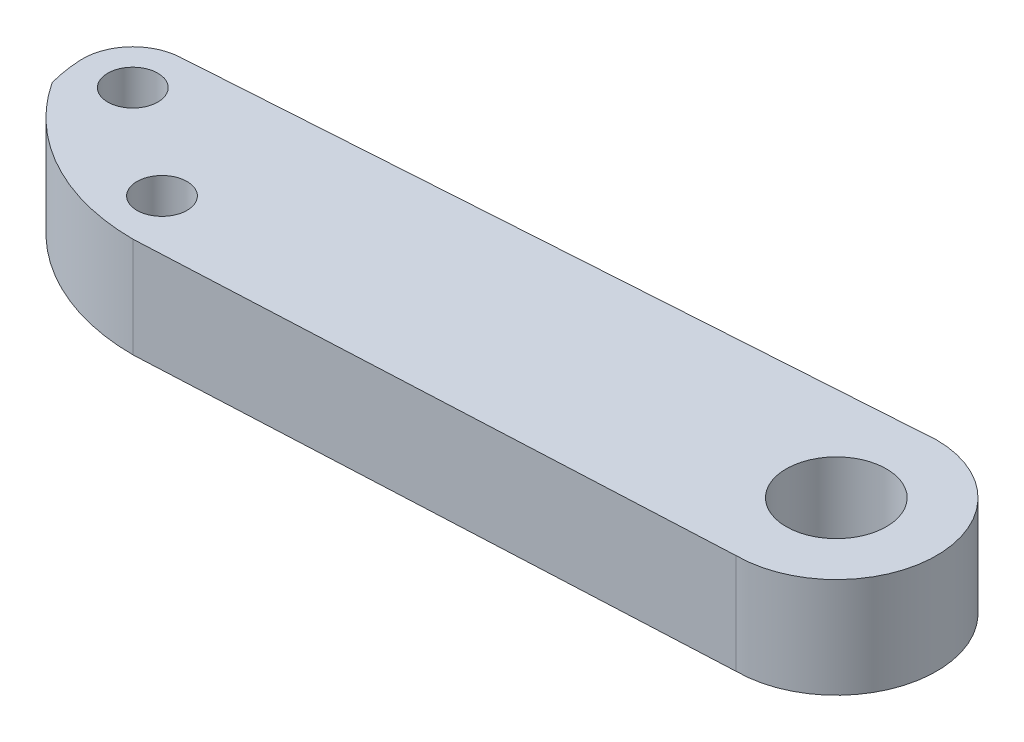
ISO-10303-21;
HEADER;
FILE_DESCRIPTION(('STEP AP214'),'2;1');
FILE_NAME('part.step','',(''),(''),'','','');
FILE_SCHEMA(('AUTOMOTIVE_DESIGN { 1 0 10303 214 1 1 1 1 }'));
ENDSEC;
DATA;
#1=APPLICATION_CONTEXT('core data for automotive mechanical design processes');
#2=APPLICATION_PROTOCOL_DEFINITION('international standard','automotive_design',2000,#1);
#3=PRODUCT_CONTEXT('',#1,'mechanical');
#4=PRODUCT('Part','Part','',(#3));
#5=PRODUCT_RELATED_PRODUCT_CATEGORY('part','',(#4));
#6=PRODUCT_DEFINITION_FORMATION('','',#4);
#7=PRODUCT_DEFINITION_CONTEXT('part definition',#1,'design');
#8=PRODUCT_DEFINITION('design','',#6,#7);
#9=PRODUCT_DEFINITION_SHAPE('','',#8);
#10=(LENGTH_UNIT() NAMED_UNIT(*) SI_UNIT(.MILLI.,.METRE.));
#11=(NAMED_UNIT(*) PLANE_ANGLE_UNIT() SI_UNIT($,.RADIAN.));
#12=(NAMED_UNIT(*) SI_UNIT($,.STERADIAN.) SOLID_ANGLE_UNIT());
#13=UNCERTAINTY_MEASURE_WITH_UNIT(LENGTH_MEASURE(1.E-05),#10,'distance_accuracy_value','');
#14=(GEOMETRIC_REPRESENTATION_CONTEXT(3) GLOBAL_UNCERTAINTY_ASSIGNED_CONTEXT((#13)) GLOBAL_UNIT_ASSIGNED_CONTEXT((#10,
#11,#12)) REPRESENTATION_CONTEXT('',''));
#15=CARTESIAN_POINT('',(0.,0.,0.));
#16=DIRECTION('',(0.,0.,1.));
#17=DIRECTION('',(1.,0.,0.));
#18=AXIS2_PLACEMENT_3D('',#15,#16,#17);
#19=CARTESIAN_POINT('',(0.247096779714024,4.,5.16918233201002));
#20=DIRECTION('',(-0.0477473874810918,0.,-0.998859443059298));
#21=DIRECTION('',(-0.998859443059298,0.,0.0477473874810918));
#22=AXIS2_PLACEMENT_3D('',#19,#20,#21);
#23=PLANE('',#22);
#24=DIRECTION('',(0.998859443059298,0.,-0.0477473874810918));
#25=VECTOR('',#24,1.);
#26=CARTESIAN_POINT('',(0.247096779714024,0.,5.16918233201002));
#27=LINE('',#26,#25);
#28=CARTESIAN_POINT('',(-4.48088767881538,0.,5.39518901144288));
#29=VERTEX_POINT('',#28);
#30=CARTESIAN_POINT('',(18.4839806159632,0.,4.29742448356832));
#31=VERTEX_POINT('',#30);
#32=EDGE_CURVE('E128',#29,#31,#27,.T.);
#33=ORIENTED_EDGE('',*,*,#32,.T.);
#34=DIRECTION('',(0.,-1.,0.));
#35=VECTOR('',#34,1.);
#36=CARTESIAN_POINT('',(18.4839806159632,4.,4.29742448356832));
#37=LINE('',#36,#35);
#38=CARTESIAN_POINT('',(18.4839806159632,4.,4.29742448356832));
#39=VERTEX_POINT('',#38);
#40=EDGE_CURVE('E11',#39,#31,#37,.T.);
#41=ORIENTED_EDGE('',*,*,#40,.F.);
#42=DIRECTION('',(0.998859443059298,0.,-0.0477473874810918));
#43=VECTOR('',#42,1.);
#44=CARTESIAN_POINT('',(0.247096779714024,4.,5.16918233201002));
#45=LINE('',#44,#43);
#46=CARTESIAN_POINT('',(-4.48088767881538,4.,5.39518901144288));
#47=VERTEX_POINT('',#46);
#48=EDGE_CURVE('E153',#47,#39,#45,.T.);
#49=ORIENTED_EDGE('',*,*,#48,.F.);
#50=DIRECTION('',(0.,-1.,0.));
#51=VECTOR('',#50,1.);
#52=CARTESIAN_POINT('',(-4.48088767881538,4.,5.39518901144288));
#53=LINE('',#52,#51);
#54=EDGE_CURVE('E118',#47,#29,#53,.T.);
#55=ORIENTED_EDGE('',*,*,#54,.T.);
#56=EDGE_LOOP('',(#33,#41,#49,#55));
#57=FACE_BOUND('',#56,.T.);
#58=ADVANCED_FACE('F34',(#57),#23,.F.);
#59=CARTESIAN_POINT('',(18.4839806159632,4.,0.297424483568243));
#60=DIRECTION('',(0.,-1.,0.));
#61=DIRECTION('',(0.,0.,-1.));
#62=AXIS2_PLACEMENT_3D('',#59,#60,#61);
#63=CYLINDRICAL_SURFACE('',#62,4.00000000000008);
#64=CARTESIAN_POINT('',(18.4839806159632,0.,0.297424483568243));
#65=DIRECTION('',(0.,1.,0.));
#66=DIRECTION('',(0.,0.,1.));
#67=AXIS2_PLACEMENT_3D('',#64,#65,#66);
#68=CIRCLE('',#67,4.00000000000008);
#69=CARTESIAN_POINT('',(18.4839806159632,0.,-3.70257551643184));
#70=VERTEX_POINT('',#69);
#71=EDGE_CURVE('E131',#31,#70,#68,.T.);
#72=ORIENTED_EDGE('',*,*,#71,.T.);
#73=DIRECTION('',(0.,-1.,0.));
#74=VECTOR('',#73,1.);
#75=CARTESIAN_POINT('',(18.4839806159632,4.,-3.70257551643184));
#76=LINE('',#75,#74);
#77=CARTESIAN_POINT('',(18.4839806159632,4.,-3.70257551643184));
#78=VERTEX_POINT('',#77);
#79=EDGE_CURVE('E43',#78,#70,#76,.T.);
#80=ORIENTED_EDGE('',*,*,#79,.F.);
#81=CARTESIAN_POINT('',(18.4839806159632,4.,0.297424483568243));
#82=DIRECTION('',(0.,1.,0.));
#83=DIRECTION('',(0.,0.,1.));
#84=AXIS2_PLACEMENT_3D('',#81,#82,#83);
#85=CIRCLE('',#84,4.00000000000008);
#86=EDGE_CURVE('E87',#39,#78,#85,.T.);
#87=ORIENTED_EDGE('',*,*,#86,.F.);
#88=ORIENTED_EDGE('',*,*,#40,.T.);
#89=EDGE_LOOP('',(#72,#80,#87,#88));
#90=FACE_BOUND('',#89,.T.);
#91=ADVANCED_FACE('F146',(#90),#63,.T.);
#92=CARTESIAN_POINT('',(-0.163034536543457,4.,-2.4735086919785));
#93=DIRECTION('',(-0.0657695447513612,0.,-0.997834839531673));
#94=DIRECTION('',(-0.997834839531673,0.,0.0657695447513612));
#95=AXIS2_PLACEMENT_3D('',#92,#93,#94);
#96=PLANE('',#95);
#97=DIRECTION('',(0.997834839531673,0.,-0.0657695447513612));
#98=VECTOR('',#97,1.);
#99=CARTESIAN_POINT('',(-0.163034536543457,0.,-2.4735086919785));
#100=LINE('',#99,#98);
#101=CARTESIAN_POINT('',(-9.863309787302,0.,-1.83414167257806));
#102=VERTEX_POINT('',#101);
#103=EDGE_CURVE('E134',#102,#70,#100,.T.);
#104=ORIENTED_EDGE('',*,*,#103,.F.);
#105=DIRECTION('',(0.,-1.,0.));
#106=VECTOR('',#105,1.);
#107=CARTESIAN_POINT('',(-9.863309787302,4.,-1.83414167257806));
#108=LINE('',#107,#106);
#109=CARTESIAN_POINT('',(-9.863309787302,4.,-1.83414167257806));
#110=VERTEX_POINT('',#109);
#111=EDGE_CURVE('E103',#110,#102,#108,.T.);
#112=ORIENTED_EDGE('',*,*,#111,.F.);
#113=DIRECTION('',(0.997834839531673,0.,-0.0657695447513612));
#114=VECTOR('',#113,1.);
#115=CARTESIAN_POINT('',(-0.163034536543457,4.,-2.4735086919785));
#116=LINE('',#115,#114);
#117=EDGE_CURVE('E112',#110,#78,#116,.T.);
#118=ORIENTED_EDGE('',*,*,#117,.T.);
#119=ORIENTED_EDGE('',*,*,#79,.T.);
#120=EDGE_LOOP('',(#104,#112,#118,#119));
#121=FACE_BOUND('',#120,.T.);
#122=ADVANCED_FACE('F145',(#121),#96,.T.);
#123=CARTESIAN_POINT('',(-9.73177069779925,4.,0.161528006485447));
#124=DIRECTION('',(0.,-1.,0.));
#125=DIRECTION('',(0.,0.,-1.));
#126=AXIS2_PLACEMENT_3D('',#123,#124,#125);
#127=CYLINDRICAL_SURFACE('',#126,2.00000000000009);
#128=CARTESIAN_POINT('',(-9.73177069779925,0.,0.161528006485447));
#129=DIRECTION('',(0.,1.,0.));
#130=DIRECTION('',(0.,0.,1.));
#131=AXIS2_PLACEMENT_3D('',#128,#129,#130);
#132=CIRCLE('',#131,2.00000000000009);
#133=CARTESIAN_POINT('',(-11.729046010991,0.,0.265889509516957));
#134=VERTEX_POINT('',#133);
#135=EDGE_CURVE('E102',#134,#102,#132,.F.);
#136=ORIENTED_EDGE('',*,*,#135,.F.);
#137=DIRECTION('',(0.,-1.,0.));
#138=VECTOR('',#137,1.);
#139=CARTESIAN_POINT('',(-11.729046010991,4.,0.265889509516957));
#140=LINE('',#139,#138);
#141=CARTESIAN_POINT('',(-11.729046010991,4.,0.265889509516957));
#142=VERTEX_POINT('',#141);
#143=EDGE_CURVE('E96',#142,#134,#140,.T.);
#144=ORIENTED_EDGE('',*,*,#143,.F.);
#145=CARTESIAN_POINT('',(-9.73177069779925,4.,0.161528006485447));
#146=DIRECTION('',(0.,1.,0.));
#147=DIRECTION('',(0.,0.,1.));
#148=AXIS2_PLACEMENT_3D('',#145,#146,#147);
#149=CIRCLE('',#148,2.00000000000009);
#150=EDGE_CURVE('E100',#142,#110,#149,.F.);
#151=ORIENTED_EDGE('',*,*,#150,.T.);
#152=ORIENTED_EDGE('',*,*,#111,.T.);
#153=EDGE_LOOP('',(#136,#144,#151,#152));
#154=FACE_BOUND('',#153,.T.);
#155=ADVANCED_FACE('F98',(#154),#127,.T.);
#156=CARTESIAN_POINT('',(-5.40566592924654,4.,-0.0645193455931592));
#157=DIRECTION('',(0.,-1.,0.));
#158=DIRECTION('',(0.,0.,-1.));
#159=AXIS2_PLACEMENT_3D('',#156,#157,#158);
#160=CYLINDRICAL_SURFACE('',#159,6.33200644896525);
#161=CARTESIAN_POINT('',(-5.40566592924654,0.,-0.0645193455931592));
#162=DIRECTION('',(0.,1.,0.));
#163=DIRECTION('',(0.,0.,1.));
#164=AXIS2_PLACEMENT_3D('',#161,#162,#163);
#165=CIRCLE('',#164,6.33200644896525);
#166=CARTESIAN_POINT('',(-11.5167543237034,0.,1.59346265215959));
#167=VERTEX_POINT('',#166);
#168=EDGE_CURVE('E73',#134,#167,#165,.T.);
#169=ORIENTED_EDGE('',*,*,#168,.T.);
#170=DIRECTION('',(0.,-1.,0.));
#171=VECTOR('',#170,1.);
#172=CARTESIAN_POINT('',(-11.5167543237034,4.,1.59346265215959));
#173=LINE('',#172,#171);
#174=CARTESIAN_POINT('',(-11.5167543237034,4.,1.59346265215959));
#175=VERTEX_POINT('',#174);
#176=EDGE_CURVE('E104',#175,#167,#173,.T.);
#177=ORIENTED_EDGE('',*,*,#176,.F.);
#178=CARTESIAN_POINT('',(-5.40566592924654,4.,-0.0645193455931592));
#179=DIRECTION('',(0.,1.,0.));
#180=DIRECTION('',(0.,0.,1.));
#181=AXIS2_PLACEMENT_3D('',#178,#179,#180);
#182=CIRCLE('',#181,6.33200644896525);
#183=EDGE_CURVE('E106',#142,#175,#182,.T.);
#184=ORIENTED_EDGE('',*,*,#183,.F.);
#185=ORIENTED_EDGE('',*,*,#143,.T.);
#186=EDGE_LOOP('',(#169,#177,#184,#185));
#187=FACE_BOUND('',#186,.T.);
#188=ADVANCED_FACE('F107',(#187),#160,.T.);
#189=CARTESIAN_POINT('',(18.4839806159632,4.,0.297424483568243));
#190=DIRECTION('',(0.,-1.,0.));
#191=DIRECTION('',(0.,0.,-1.));
#192=AXIS2_PLACEMENT_3D('',#189,#190,#191);
#193=CYLINDRICAL_SURFACE('',#192,2.);
#194=CARTESIAN_POINT('',(18.4839806159632,4.,0.297424483568243));
#195=DIRECTION('',(0.,1.,0.));
#196=DIRECTION('',(0.,0.,1.));
#197=AXIS2_PLACEMENT_3D('',#194,#195,#196);
#198=CIRCLE('',#197,2.);
#199=CARTESIAN_POINT('',(18.4839806159632,4.,2.29742448356824));
#200=VERTEX_POINT('',#199);
#201=EDGE_CURVE('E260',#200,#200,#198,.T.);
#202=ORIENTED_EDGE('',*,*,#201,.T.);
#203=EDGE_LOOP('',(#202));
#204=FACE_BOUND('',#203,.T.);
#205=CARTESIAN_POINT('',(18.4839806159632,0.,0.297424483568243));
#206=DIRECTION('',(0.,1.,0.));
#207=DIRECTION('',(0.,0.,1.));
#208=AXIS2_PLACEMENT_3D('',#205,#206,#207);
#209=CIRCLE('',#208,2.);
#210=CARTESIAN_POINT('',(18.4839806159632,0.,2.29742448356824));
#211=VERTEX_POINT('',#210);
#212=EDGE_CURVE('E125',#211,#211,#209,.T.);
#213=ORIENTED_EDGE('',*,*,#212,.F.);
#214=EDGE_LOOP('',(#213));
#215=FACE_BOUND('',#214,.T.);
#216=ADVANCED_FACE('F175',(#204,#215),#193,.F.);
#217=CARTESIAN_POINT('',(-9.73177069779925,4.,0.161528006485447));
#218=DIRECTION('',(0.,-1.,0.));
#219=DIRECTION('',(0.,0.,-1.));
#220=AXIS2_PLACEMENT_3D('',#217,#218,#219);
#221=CYLINDRICAL_SURFACE('',#220,1.);
#222=CARTESIAN_POINT('',(-9.73177069779925,4.,0.161528006485447));
#223=DIRECTION('',(0.,1.,0.));
#224=DIRECTION('',(0.,0.,1.));
#225=AXIS2_PLACEMENT_3D('',#222,#223,#224);
#226=CIRCLE('',#225,1.);
#227=CARTESIAN_POINT('',(-9.73177069779925,4.,1.16152800648545));
#228=VERTEX_POINT('',#227);
#229=EDGE_CURVE('E185',#228,#228,#226,.T.);
#230=ORIENTED_EDGE('',*,*,#229,.T.);
#231=EDGE_LOOP('',(#230));
#232=FACE_BOUND('',#231,.T.);
#233=CARTESIAN_POINT('',(-9.73177069779925,0.,0.161528006485447));
#234=DIRECTION('',(0.,1.,0.));
#235=DIRECTION('',(0.,0.,1.));
#236=AXIS2_PLACEMENT_3D('',#233,#234,#235);
#237=CIRCLE('',#236,1.);
#238=CARTESIAN_POINT('',(-9.73177069779925,0.,1.16152800648545));
#239=VERTEX_POINT('',#238);
#240=EDGE_CURVE('E122',#239,#239,#237,.T.);
#241=ORIENTED_EDGE('',*,*,#240,.F.);
#242=EDGE_LOOP('',(#241));
#243=FACE_BOUND('',#242,.T.);
#244=ADVANCED_FACE('F163',(#232,#243),#221,.F.);
#245=CARTESIAN_POINT('',(-5.40566592924654,4.,3.32132833882781));
#246=DIRECTION('',(0.,-1.,0.));
#247=DIRECTION('',(0.,0.,-1.));
#248=AXIS2_PLACEMENT_3D('',#245,#246,#247);
#249=CYLINDRICAL_SURFACE('',#248,1.);
#250=CARTESIAN_POINT('',(-5.40566592924654,4.,3.32132833882781));
#251=DIRECTION('',(0.,1.,0.));
#252=DIRECTION('',(0.,0.,1.));
#253=AXIS2_PLACEMENT_3D('',#250,#251,#252);
#254=CIRCLE('',#253,1.);
#255=CARTESIAN_POINT('',(-5.40566592924654,4.,4.32132833882781));
#256=VERTEX_POINT('',#255);
#257=EDGE_CURVE('E140',#256,#256,#254,.T.);
#258=ORIENTED_EDGE('',*,*,#257,.T.);
#259=EDGE_LOOP('',(#258));
#260=FACE_BOUND('',#259,.T.);
#261=CARTESIAN_POINT('',(-5.40566592924654,0.,3.32132833882781));
#262=DIRECTION('',(0.,1.,0.));
#263=DIRECTION('',(0.,0.,1.));
#264=AXIS2_PLACEMENT_3D('',#261,#262,#263);
#265=CIRCLE('',#264,1.);
#266=CARTESIAN_POINT('',(-5.40566592924654,0.,4.32132833882781));
#267=VERTEX_POINT('',#266);
#268=EDGE_CURVE('E119',#267,#267,#265,.T.);
#269=ORIENTED_EDGE('',*,*,#268,.F.);
#270=EDGE_LOOP('',(#269));
#271=FACE_BOUND('',#270,.T.);
#272=ADVANCED_FACE('F36',(#260,#271),#249,.F.);
#273=CARTESIAN_POINT('',(-4.48088767881538,4.,-3.01632416852917));
#274=DIRECTION('',(0.,-1.,0.));
#275=DIRECTION('',(0.,0.,-1.));
#276=AXIS2_PLACEMENT_3D('',#273,#274,#275);
#277=CYLINDRICAL_SURFACE('',#276,8.41151317997205);
#278=CARTESIAN_POINT('',(-4.48088767881538,0.,-3.01632416852917));
#279=DIRECTION('',(0.,1.,0.));
#280=DIRECTION('',(0.,0.,1.));
#281=AXIS2_PLACEMENT_3D('',#278,#279,#280);
#282=CIRCLE('',#281,8.41151317997205);
#283=EDGE_CURVE('E79',#167,#29,#282,.T.);
#284=ORIENTED_EDGE('',*,*,#283,.T.);
#285=ORIENTED_EDGE('',*,*,#54,.F.);
#286=CARTESIAN_POINT('',(-4.48088767881538,4.,-3.01632416852917));
#287=DIRECTION('',(0.,1.,0.));
#288=DIRECTION('',(0.,0.,1.));
#289=AXIS2_PLACEMENT_3D('',#286,#287,#288);
#290=CIRCLE('',#289,8.41151317997205);
#291=EDGE_CURVE('E51',#175,#47,#290,.T.);
#292=ORIENTED_EDGE('',*,*,#291,.F.);
#293=ORIENTED_EDGE('',*,*,#176,.T.);
#294=EDGE_LOOP('',(#284,#285,#292,#293));
#295=FACE_BOUND('',#294,.T.);
#296=ADVANCED_FACE('F154',(#295),#277,.T.);
#297=CARTESIAN_POINT('',(0.,4.,0.));
#298=DIRECTION('',(0.,1.,0.));
#299=DIRECTION('',(0.,0.,1.));
#300=AXIS2_PLACEMENT_3D('',#297,#298,#299);
#301=PLANE('',#300);
#302=ORIENTED_EDGE('',*,*,#257,.F.);
#303=EDGE_LOOP('',(#302));
#304=FACE_BOUND('',#303,.T.);
#305=ORIENTED_EDGE('',*,*,#229,.F.);
#306=EDGE_LOOP('',(#305));
#307=FACE_BOUND('',#306,.T.);
#308=ORIENTED_EDGE('',*,*,#201,.F.);
#309=EDGE_LOOP('',(#308));
#310=FACE_BOUND('',#309,.T.);
#311=ORIENTED_EDGE('',*,*,#48,.T.);
#312=ORIENTED_EDGE('',*,*,#86,.T.);
#313=ORIENTED_EDGE('',*,*,#117,.F.);
#314=ORIENTED_EDGE('',*,*,#150,.F.);
#315=ORIENTED_EDGE('',*,*,#183,.T.);
#316=ORIENTED_EDGE('',*,*,#291,.T.);
#317=EDGE_LOOP('',(#311,#312,#313,#314,#315,#316));
#318=FACE_BOUND('',#317,.T.);
#319=ADVANCED_FACE('F110',(#304,#307,#310,#318),#301,.T.);
#320=CARTESIAN_POINT('',(0.,0.,0.));
#321=DIRECTION('',(0.,1.,0.));
#322=DIRECTION('',(0.,0.,1.));
#323=AXIS2_PLACEMENT_3D('',#320,#321,#322);
#324=PLANE('',#323);
#325=ORIENTED_EDGE('',*,*,#268,.T.);
#326=EDGE_LOOP('',(#325));
#327=FACE_BOUND('',#326,.T.);
#328=ORIENTED_EDGE('',*,*,#240,.T.);
#329=EDGE_LOOP('',(#328));
#330=FACE_BOUND('',#329,.T.);
#331=ORIENTED_EDGE('',*,*,#212,.T.);
#332=EDGE_LOOP('',(#331));
#333=FACE_BOUND('',#332,.T.);
#334=ORIENTED_EDGE('',*,*,#32,.F.);
#335=ORIENTED_EDGE('',*,*,#283,.F.);
#336=ORIENTED_EDGE('',*,*,#168,.F.);
#337=ORIENTED_EDGE('',*,*,#135,.T.);
#338=ORIENTED_EDGE('',*,*,#103,.T.);
#339=ORIENTED_EDGE('',*,*,#71,.F.);
#340=EDGE_LOOP('',(#334,#335,#336,#337,#338,#339));
#341=FACE_BOUND('',#340,.T.);
#342=ADVANCED_FACE('F150',(#327,#330,#333,#341),#324,.F.);
#343=CLOSED_SHELL('',(#58,#91,#122,#155,#188,#216,#244,#272,#296,#319,#342));
#344=MANIFOLD_SOLID_BREP('B2',#343);
#345=ADVANCED_BREP_SHAPE_REPRESENTATION('',(#18,#344),#14);
#346=SHAPE_DEFINITION_REPRESENTATION(#9,#345);
ENDSEC;
END-ISO-10303-21;
